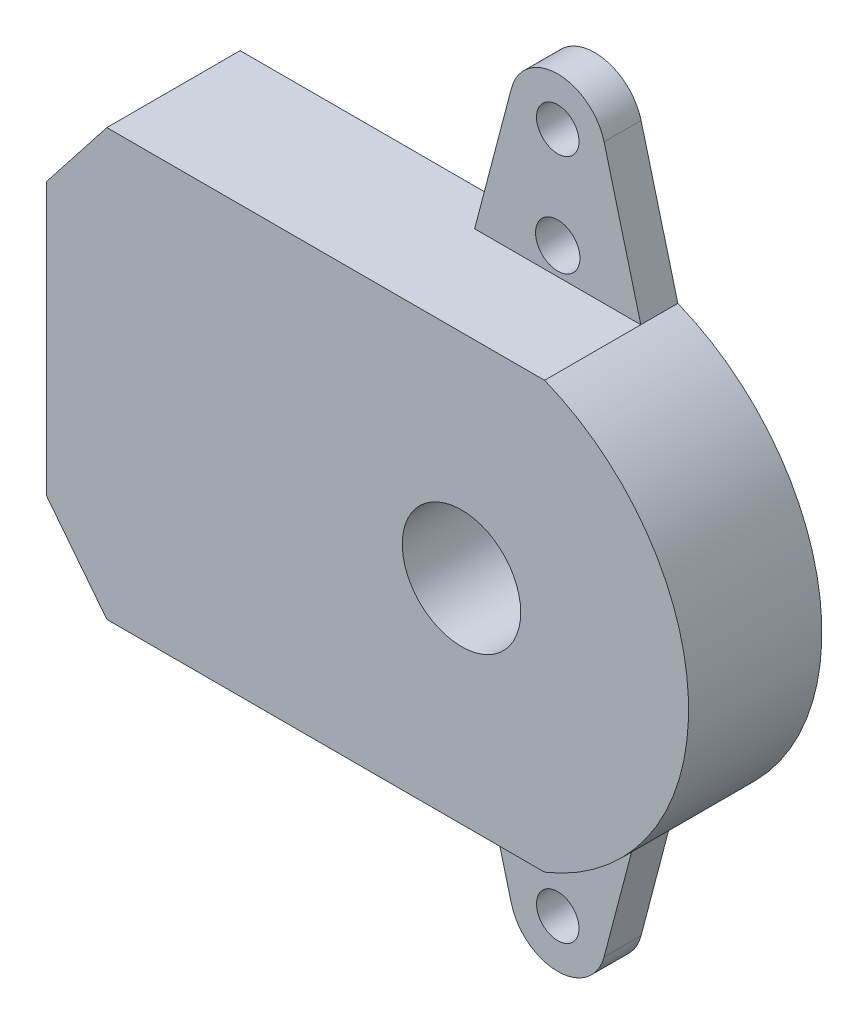
ISO-10303-21;
HEADER;
FILE_DESCRIPTION(('STEP AP214'),'2;1');
FILE_NAME('part.step','',(''),(''),'','','');
FILE_SCHEMA(('AUTOMOTIVE_DESIGN { 1 0 10303 214 1 1 1 1 }'));
ENDSEC;
DATA;
#1=APPLICATION_CONTEXT('core data for automotive mechanical design processes');
#2=APPLICATION_PROTOCOL_DEFINITION('international standard','automotive_design',2000,#1);
#3=PRODUCT_CONTEXT('',#1,'mechanical');
#4=PRODUCT('Part','Part','',(#3));
#5=PRODUCT_RELATED_PRODUCT_CATEGORY('part','',(#4));
#6=PRODUCT_DEFINITION_FORMATION('','',#4);
#7=PRODUCT_DEFINITION_CONTEXT('part definition',#1,'design');
#8=PRODUCT_DEFINITION('design','',#6,#7);
#9=PRODUCT_DEFINITION_SHAPE('','',#8);
#10=(LENGTH_UNIT() NAMED_UNIT(*) SI_UNIT(.MILLI.,.METRE.));
#11=(NAMED_UNIT(*) PLANE_ANGLE_UNIT() SI_UNIT($,.RADIAN.));
#12=(NAMED_UNIT(*) SI_UNIT($,.STERADIAN.) SOLID_ANGLE_UNIT());
#13=UNCERTAINTY_MEASURE_WITH_UNIT(LENGTH_MEASURE(1.E-05),#10,'distance_accuracy_value','');
#14=(GEOMETRIC_REPRESENTATION_CONTEXT(3) GLOBAL_UNCERTAINTY_ASSIGNED_CONTEXT((#13)) GLOBAL_UNIT_ASSIGNED_CONTEXT((#10,
#11,#12)) REPRESENTATION_CONTEXT('',''));
#15=CARTESIAN_POINT('',(0.,0.,0.));
#16=DIRECTION('',(0.,0.,1.));
#17=DIRECTION('',(1.,0.,0.));
#18=AXIS2_PLACEMENT_3D('',#15,#16,#17);
#19=CARTESIAN_POINT('',(28.04,-8.6275,2.5));
#20=DIRECTION('',(0.,0.,1.));
#21=DIRECTION('',(1.,0.,0.));
#22=AXIS2_PLACEMENT_3D('',#19,#20,#21);
#23=PLANE('',#22);
#24=DIRECTION('',(-1.,0.,0.));
#25=VECTOR('',#24,1.);
#26=CARTESIAN_POINT('',(4.08749837592054,28.77,2.5));
#27=LINE('',#26,#25);
#28=CARTESIAN_POINT('',(33.6525016240795,28.77,2.5));
#29=VERTEX_POINT('',#28);
#30=CARTESIAN_POINT('',(22.4274983759205,28.77,2.5));
#31=VERTEX_POINT('',#30);
#32=EDGE_CURVE('E129',#29,#31,#27,.T.);
#33=ORIENTED_EDGE('',*,*,#32,.F.);
#34=DIRECTION('',(-0.253955475555716,0.967215909937006,0.));
#35=VECTOR('',#34,1.);
#36=CARTESIAN_POINT('',(31.1713615084211,38.2196808521116,2.5));
#37=LINE('',#36,#35);
#38=CARTESIAN_POINT('',(31.1713615084211,38.2196808521116,2.5));
#39=VERTEX_POINT('',#38);
#40=EDGE_CURVE('E122',#29,#39,#37,.T.);
#41=ORIENTED_EDGE('',*,*,#40,.T.);
#42=CARTESIAN_POINT('',(28.04,37.3975,2.5));
#43=DIRECTION('',(0.,0.,1.));
#44=DIRECTION('',(-1.,0.,0.));
#45=AXIS2_PLACEMENT_3D('',#42,#43,#44);
#46=CIRCLE('',#45,3.2375);
#47=CARTESIAN_POINT('',(24.9086384915789,38.2196808521116,2.5));
#48=VERTEX_POINT('',#47);
#49=EDGE_CURVE('E126',#39,#48,#46,.T.);
#50=ORIENTED_EDGE('',*,*,#49,.T.);
#51=DIRECTION('',(-0.253955475555716,-0.967215909937006,0.));
#52=VECTOR('',#51,1.);
#53=CARTESIAN_POINT('',(22.4274983759205,28.77,2.5));
#54=LINE('',#53,#52);
#55=EDGE_CURVE('E54',#48,#31,#54,.T.);
#56=ORIENTED_EDGE('',*,*,#55,.T.);
#57=EDGE_LOOP('',(#33,#41,#50,#56));
#58=FACE_BOUND('',#57,.T.);
#59=CARTESIAN_POINT('',(28.04,37.3975,2.5));
#60=DIRECTION('',(0.,0.,1.));
#61=DIRECTION('',(1.,0.,0.));
#62=AXIS2_PLACEMENT_3D('',#59,#60,#61);
#63=CIRCLE('',#62,1.435);
#64=CARTESIAN_POINT('',(29.475,37.3975,2.5));
#65=VERTEX_POINT('',#64);
#66=EDGE_CURVE('E156',#65,#65,#63,.T.);
#67=ORIENTED_EDGE('',*,*,#66,.F.);
#68=EDGE_LOOP('',(#67));
#69=FACE_BOUND('',#68,.T.);
#70=CARTESIAN_POINT('',(28.04,30.6,2.5));
#71=DIRECTION('',(0.,0.,1.));
#72=DIRECTION('',(1.,0.,0.));
#73=AXIS2_PLACEMENT_3D('',#70,#71,#72);
#74=CIRCLE('',#73,1.5);
#75=CARTESIAN_POINT('',(29.54,30.6,2.5));
#76=VERTEX_POINT('',#75);
#77=EDGE_CURVE('E215',#76,#76,#74,.T.);
#78=ORIENTED_EDGE('',*,*,#77,.F.);
#79=EDGE_LOOP('',(#78));
#80=FACE_BOUND('',#79,.T.);
#81=ADVANCED_FACE('F35',(#58,#69,#80),#23,.T.);
#82=DIRECTION('',(1.,0.,0.));
#83=VECTOR('',#82,1.);
#84=CARTESIAN_POINT('',(33.6525016240795,0.,2.5));
#85=LINE('',#84,#83);
#86=CARTESIAN_POINT('',(22.4274983759205,0.,2.5));
#87=VERTEX_POINT('',#86);
#88=CARTESIAN_POINT('',(33.6525016240795,0.,2.5));
#89=VERTEX_POINT('',#88);
#90=EDGE_CURVE('E11',#87,#89,#85,.T.);
#91=ORIENTED_EDGE('',*,*,#90,.F.);
#92=DIRECTION('',(0.253955475555716,-0.967215909937006,0.));
#93=VECTOR('',#92,1.);
#94=CARTESIAN_POINT('',(22.4274983759205,0.,2.5));
#95=LINE('',#94,#93);
#96=CARTESIAN_POINT('',(24.9086384915789,-9.44968085211163,2.5));
#97=VERTEX_POINT('',#96);
#98=EDGE_CURVE('E175',#87,#97,#95,.T.);
#99=ORIENTED_EDGE('',*,*,#98,.T.);
#100=CARTESIAN_POINT('',(28.04,-8.6275,2.5));
#101=DIRECTION('',(0.,0.,1.));
#102=DIRECTION('',(1.,0.,0.));
#103=AXIS2_PLACEMENT_3D('',#100,#101,#102);
#104=CIRCLE('',#103,3.2375);
#105=CARTESIAN_POINT('',(31.1713615084211,-9.44968085211163,2.5));
#106=VERTEX_POINT('',#105);
#107=EDGE_CURVE('E231',#97,#106,#104,.T.);
#108=ORIENTED_EDGE('',*,*,#107,.T.);
#109=DIRECTION('',(0.253955475555716,0.967215909937006,0.));
#110=VECTOR('',#109,1.);
#111=CARTESIAN_POINT('',(31.1713615084211,-9.44968085211163,2.5));
#112=LINE('',#111,#110);
#113=EDGE_CURVE('E134',#106,#89,#112,.T.);
#114=ORIENTED_EDGE('',*,*,#113,.T.);
#115=EDGE_LOOP('',(#91,#99,#108,#114));
#116=FACE_BOUND('',#115,.T.);
#117=CARTESIAN_POINT('',(28.04,-8.6275,2.5));
#118=DIRECTION('',(0.,0.,1.));
#119=DIRECTION('',(1.,0.,0.));
#120=AXIS2_PLACEMENT_3D('',#117,#118,#119);
#121=CIRCLE('',#120,1.435);
#122=CARTESIAN_POINT('',(29.475,-8.6275,2.5));
#123=VERTEX_POINT('',#122);
#124=EDGE_CURVE('E221',#123,#123,#121,.T.);
#125=ORIENTED_EDGE('',*,*,#124,.F.);
#126=EDGE_LOOP('',(#125));
#127=FACE_BOUND('',#126,.T.);
#128=CARTESIAN_POINT('',(28.04,-1.83,2.5));
#129=DIRECTION('',(0.,0.,1.));
#130=DIRECTION('',(1.,0.,0.));
#131=AXIS2_PLACEMENT_3D('',#128,#129,#130);
#132=CIRCLE('',#131,1.5);
#133=CARTESIAN_POINT('',(29.54,-1.83,2.5));
#134=VERTEX_POINT('',#133);
#135=EDGE_CURVE('E208',#134,#134,#132,.T.);
#136=ORIENTED_EDGE('',*,*,#135,.F.);
#137=EDGE_LOOP('',(#136));
#138=FACE_BOUND('',#137,.T.);
#139=ADVANCED_FACE('F233',(#116,#127,#138),#23,.T.);
#140=CARTESIAN_POINT('',(28.04,-8.6275,0.));
#141=DIRECTION('',(0.,0.,1.));
#142=DIRECTION('',(1.,0.,0.));
#143=AXIS2_PLACEMENT_3D('',#140,#141,#142);
#144=PLANE('',#143);
#145=CARTESIAN_POINT('',(28.04,14.385,0.));
#146=DIRECTION('',(0.,0.,1.));
#147=DIRECTION('',(1.,0.,0.));
#148=AXIS2_PLACEMENT_3D('',#145,#146,#147);
#149=CIRCLE('',#148,4.);
#150=CARTESIAN_POINT('',(32.04,14.385,0.));
#151=VERTEX_POINT('',#150);
#152=EDGE_CURVE('E205',#151,#151,#149,.T.);
#153=ORIENTED_EDGE('',*,*,#152,.T.);
#154=EDGE_LOOP('',(#153));
#155=FACE_BOUND('',#154,.T.);
#156=DIRECTION('',(-0.616887828188147,-0.787051083115519,0.));
#157=VECTOR('',#156,1.);
#158=CARTESIAN_POINT('',(4.08749837592054,28.77,0.));
#159=LINE('',#158,#157);
#160=CARTESIAN_POINT('',(4.08749837592054,28.77,0.));
#161=VERTEX_POINT('',#160);
#162=CARTESIAN_POINT('',(0.,23.555,0.));
#163=VERTEX_POINT('',#162);
#164=EDGE_CURVE('E152',#161,#163,#159,.T.);
#165=ORIENTED_EDGE('',*,*,#164,.F.);
#166=DIRECTION('',(-1.,0.,0.));
#167=VECTOR('',#166,1.);
#168=CARTESIAN_POINT('',(22.4274983759205,28.77,0.));
#169=LINE('',#168,#167);
#170=CARTESIAN_POINT('',(22.4274983759205,28.77,0.));
#171=VERTEX_POINT('',#170);
#172=EDGE_CURVE('E102',#171,#161,#169,.T.);
#173=ORIENTED_EDGE('',*,*,#172,.F.);
#174=DIRECTION('',(-0.253955475555716,-0.967215909937006,0.));
#175=VECTOR('',#174,1.);
#176=CARTESIAN_POINT('',(22.4274983759205,28.77,0.));
#177=LINE('',#176,#175);
#178=CARTESIAN_POINT('',(24.9086384915789,38.2196808521116,0.));
#179=VERTEX_POINT('',#178);
#180=EDGE_CURVE('E95',#179,#171,#177,.T.);
#181=ORIENTED_EDGE('',*,*,#180,.F.);
#182=CARTESIAN_POINT('',(28.04,37.3975,0.));
#183=DIRECTION('',(0.,0.,1.));
#184=DIRECTION('',(-1.,0.,0.));
#185=AXIS2_PLACEMENT_3D('',#182,#183,#184);
#186=CIRCLE('',#185,3.2375);
#187=CARTESIAN_POINT('',(31.1713615084211,38.2196808521116,0.));
#188=VERTEX_POINT('',#187);
#189=EDGE_CURVE('E171',#188,#179,#186,.T.);
#190=ORIENTED_EDGE('',*,*,#189,.F.);
#191=DIRECTION('',(-0.253955475555716,0.967215909937006,0.));
#192=VECTOR('',#191,1.);
#193=CARTESIAN_POINT('',(31.1713615084211,38.2196808521116,0.));
#194=LINE('',#193,#192);
#195=CARTESIAN_POINT('',(33.6525016240795,28.77,0.));
#196=VERTEX_POINT('',#195);
#197=EDGE_CURVE('E140',#196,#188,#194,.T.);
#198=ORIENTED_EDGE('',*,*,#197,.F.);
#199=CARTESIAN_POINT('',(27.88,14.385,0.));
#200=DIRECTION('',(0.,0.,1.));
#201=DIRECTION('',(1.,0.,0.));
#202=AXIS2_PLACEMENT_3D('',#199,#200,#201);
#203=CIRCLE('',#202,15.5);
#204=CARTESIAN_POINT('',(33.6525016240795,0.,0.));
#205=VERTEX_POINT('',#204);
#206=EDGE_CURVE('E168',#205,#196,#203,.T.);
#207=ORIENTED_EDGE('',*,*,#206,.F.);
#208=DIRECTION('',(0.253955475555716,0.967215909937006,0.));
#209=VECTOR('',#208,1.);
#210=CARTESIAN_POINT('',(31.1713615084211,-9.44968085211163,0.));
#211=LINE('',#210,#209);
#212=CARTESIAN_POINT('',(31.1713615084211,-9.44968085211163,0.));
#213=VERTEX_POINT('',#212);
#214=EDGE_CURVE('E166',#213,#205,#211,.T.);
#215=ORIENTED_EDGE('',*,*,#214,.F.);
#216=CARTESIAN_POINT('',(28.04,-8.6275,0.));
#217=DIRECTION('',(0.,0.,1.));
#218=DIRECTION('',(1.,0.,0.));
#219=AXIS2_PLACEMENT_3D('',#216,#217,#218);
#220=CIRCLE('',#219,3.2375);
#221=CARTESIAN_POINT('',(24.9086384915789,-9.44968085211163,0.));
#222=VERTEX_POINT('',#221);
#223=EDGE_CURVE('E164',#222,#213,#220,.T.);
#224=ORIENTED_EDGE('',*,*,#223,.F.);
#225=DIRECTION('',(0.253955475555716,-0.967215909937006,0.));
#226=VECTOR('',#225,1.);
#227=CARTESIAN_POINT('',(22.4274983759205,0.,0.));
#228=LINE('',#227,#226);
#229=CARTESIAN_POINT('',(22.4274983759205,0.,0.));
#230=VERTEX_POINT('',#229);
#231=EDGE_CURVE('E162',#230,#222,#228,.T.);
#232=ORIENTED_EDGE('',*,*,#231,.F.);
#233=DIRECTION('',(1.,0.,0.));
#234=VECTOR('',#233,1.);
#235=CARTESIAN_POINT('',(4.08749837592054,0.,0.));
#236=LINE('',#235,#234);
#237=CARTESIAN_POINT('',(4.08749837592054,0.,0.));
#238=VERTEX_POINT('',#237);
#239=EDGE_CURVE('E160',#238,#230,#236,.T.);
#240=ORIENTED_EDGE('',*,*,#239,.F.);
#241=DIRECTION('',(0.616887828188146,-0.787051083115519,0.));
#242=VECTOR('',#241,1.);
#243=CARTESIAN_POINT('',(0.,5.215,0.));
#244=LINE('',#243,#242);
#245=CARTESIAN_POINT('',(0.,5.215,0.));
#246=VERTEX_POINT('',#245);
#247=EDGE_CURVE('E158',#246,#238,#244,.T.);
#248=ORIENTED_EDGE('',*,*,#247,.F.);
#249=DIRECTION('',(0.,-1.,0.));
#250=VECTOR('',#249,1.);
#251=CARTESIAN_POINT('',(0.,23.555,0.));
#252=LINE('',#251,#250);
#253=EDGE_CURVE('E155',#163,#246,#252,.T.);
#254=ORIENTED_EDGE('',*,*,#253,.F.);
#255=EDGE_LOOP('',(#165,#173,#181,#190,#198,#207,#215,#224,#232,#240,#248,#254));
#256=FACE_BOUND('',#255,.T.);
#257=CARTESIAN_POINT('',(28.04,37.3975,0.));
#258=DIRECTION('',(0.,0.,1.));
#259=DIRECTION('',(1.,0.,0.));
#260=AXIS2_PLACEMENT_3D('',#257,#258,#259);
#261=CIRCLE('',#260,1.435);
#262=CARTESIAN_POINT('',(29.475,37.3975,0.));
#263=VERTEX_POINT('',#262);
#264=EDGE_CURVE('E224',#263,#263,#261,.T.);
#265=ORIENTED_EDGE('',*,*,#264,.T.);
#266=EDGE_LOOP('',(#265));
#267=FACE_BOUND('',#266,.T.);
#268=CARTESIAN_POINT('',(28.04,-8.6275,0.));
#269=DIRECTION('',(0.,0.,1.));
#270=DIRECTION('',(1.,0.,0.));
#271=AXIS2_PLACEMENT_3D('',#268,#269,#270);
#272=CIRCLE('',#271,1.435);
#273=CARTESIAN_POINT('',(29.475,-8.6275,0.));
#274=VERTEX_POINT('',#273);
#275=EDGE_CURVE('E218',#274,#274,#272,.T.);
#276=ORIENTED_EDGE('',*,*,#275,.T.);
#277=EDGE_LOOP('',(#276));
#278=FACE_BOUND('',#277,.T.);
#279=CARTESIAN_POINT('',(28.04,30.6,0.));
#280=DIRECTION('',(0.,0.,1.));
#281=DIRECTION('',(1.,0.,0.));
#282=AXIS2_PLACEMENT_3D('',#279,#280,#281);
#283=CIRCLE('',#282,1.5);
#284=CARTESIAN_POINT('',(29.54,30.6,0.));
#285=VERTEX_POINT('',#284);
#286=EDGE_CURVE('E211',#285,#285,#283,.T.);
#287=ORIENTED_EDGE('',*,*,#286,.T.);
#288=EDGE_LOOP('',(#287));
#289=FACE_BOUND('',#288,.T.);
#290=CARTESIAN_POINT('',(28.04,-1.83,0.));
#291=DIRECTION('',(0.,0.,1.));
#292=DIRECTION('',(1.,0.,0.));
#293=AXIS2_PLACEMENT_3D('',#290,#291,#292);
#294=CIRCLE('',#293,1.5);
#295=CARTESIAN_POINT('',(29.54,-1.83,0.));
#296=VERTEX_POINT('',#295);
#297=EDGE_CURVE('E212',#296,#296,#294,.T.);
#298=ORIENTED_EDGE('',*,*,#297,.T.);
#299=EDGE_LOOP('',(#298));
#300=FACE_BOUND('',#299,.T.);
#301=ADVANCED_FACE('F310',(#155,#256,#267,#278,#289,#300),#144,.F.);
#302=CARTESIAN_POINT('',(4.08749837592054,28.77,2.5));
#303=DIRECTION('',(0.787051083115519,-0.616887828188147,0.));
#304=DIRECTION('',(0.616887828188147,0.787051083115519,0.));
#305=AXIS2_PLACEMENT_3D('',#302,#303,#304);
#306=PLANE('',#305);
#307=ORIENTED_EDGE('',*,*,#164,.T.);
#308=DIRECTION('',(0.,0.,-1.));
#309=VECTOR('',#308,1.);
#310=CARTESIAN_POINT('',(0.,23.555,2.5));
#311=LINE('',#310,#309);
#312=CARTESIAN_POINT('',(0.,23.555,9.));
#313=VERTEX_POINT('',#312);
#314=EDGE_CURVE('E45',#313,#163,#311,.T.);
#315=ORIENTED_EDGE('',*,*,#314,.F.);
#316=DIRECTION('',(-0.616887828188147,-0.787051083115519,0.));
#317=VECTOR('',#316,1.);
#318=CARTESIAN_POINT('',(4.08749837592054,28.77,9.));
#319=LINE('',#318,#317);
#320=CARTESIAN_POINT('',(4.08749837592054,28.77,9.));
#321=VERTEX_POINT('',#320);
#322=EDGE_CURVE('E204',#321,#313,#319,.T.);
#323=ORIENTED_EDGE('',*,*,#322,.F.);
#324=DIRECTION('',(0.,0.,-1.));
#325=VECTOR('',#324,1.);
#326=CARTESIAN_POINT('',(4.08749837592054,28.77,2.5));
#327=LINE('',#326,#325);
#328=EDGE_CURVE('E148',#321,#161,#327,.T.);
#329=ORIENTED_EDGE('',*,*,#328,.T.);
#330=EDGE_LOOP('',(#307,#315,#323,#329));
#331=FACE_BOUND('',#330,.T.);
#332=ADVANCED_FACE('F37',(#331),#306,.F.);
#333=CARTESIAN_POINT('',(0.,23.555,2.5));
#334=DIRECTION('',(1.,0.,0.));
#335=DIRECTION('',(0.,0.,-1.));
#336=AXIS2_PLACEMENT_3D('',#333,#334,#335);
#337=PLANE('',#336);
#338=ORIENTED_EDGE('',*,*,#253,.T.);
#339=DIRECTION('',(0.,0.,-1.));
#340=VECTOR('',#339,1.);
#341=CARTESIAN_POINT('',(0.,5.215,2.5));
#342=LINE('',#341,#340);
#343=CARTESIAN_POINT('',(0.,5.215,9.));
#344=VERTEX_POINT('',#343);
#345=EDGE_CURVE('E193',#344,#246,#342,.T.);
#346=ORIENTED_EDGE('',*,*,#345,.F.);
#347=DIRECTION('',(0.,-1.,0.));
#348=VECTOR('',#347,1.);
#349=CARTESIAN_POINT('',(0.,5.215,9.));
#350=LINE('',#349,#348);
#351=EDGE_CURVE('E268',#313,#344,#350,.T.);
#352=ORIENTED_EDGE('',*,*,#351,.F.);
#353=ORIENTED_EDGE('',*,*,#314,.T.);
#354=EDGE_LOOP('',(#338,#346,#352,#353));
#355=FACE_BOUND('',#354,.T.);
#356=ADVANCED_FACE('F304',(#355),#337,.F.);
#357=CARTESIAN_POINT('',(0.,5.215,2.5));
#358=DIRECTION('',(0.787051083115519,0.616887828188146,0.));
#359=DIRECTION('',(-0.616887828188146,0.787051083115519,0.));
#360=AXIS2_PLACEMENT_3D('',#357,#358,#359);
#361=PLANE('',#360);
#362=ORIENTED_EDGE('',*,*,#247,.T.);
#363=DIRECTION('',(0.,0.,-1.));
#364=VECTOR('',#363,1.);
#365=CARTESIAN_POINT('',(4.08749837592054,0.,2.5));
#366=LINE('',#365,#364);
#367=CARTESIAN_POINT('',(4.08749837592054,0.,9.));
#368=VERTEX_POINT('',#367);
#369=EDGE_CURVE('E190',#368,#238,#366,.T.);
#370=ORIENTED_EDGE('',*,*,#369,.F.);
#371=DIRECTION('',(0.616887828188146,-0.787051083115519,0.));
#372=VECTOR('',#371,1.);
#373=CARTESIAN_POINT('',(4.08749837592054,0.,9.));
#374=LINE('',#373,#372);
#375=EDGE_CURVE('E265',#344,#368,#374,.T.);
#376=ORIENTED_EDGE('',*,*,#375,.F.);
#377=ORIENTED_EDGE('',*,*,#345,.T.);
#378=EDGE_LOOP('',(#362,#370,#376,#377));
#379=FACE_BOUND('',#378,.T.);
#380=ADVANCED_FACE('F307',(#379),#361,.F.);
#381=CARTESIAN_POINT('',(4.08749837592054,0.,2.5));
#382=DIRECTION('',(0.,1.,0.));
#383=DIRECTION('',(-1.,0.,0.));
#384=AXIS2_PLACEMENT_3D('',#381,#382,#383);
#385=PLANE('',#384);
#386=ORIENTED_EDGE('',*,*,#239,.T.);
#387=DIRECTION('',(0.,0.,-1.));
#388=VECTOR('',#387,1.);
#389=CARTESIAN_POINT('',(22.4274983759205,0.,2.5));
#390=LINE('',#389,#388);
#391=EDGE_CURVE('E189',#87,#230,#390,.T.);
#392=ORIENTED_EDGE('',*,*,#391,.F.);
#393=ORIENTED_EDGE('',*,*,#90,.T.);
#394=DIRECTION('',(0.,0.,-1.));
#395=VECTOR('',#394,1.);
#396=CARTESIAN_POINT('',(33.6525016240795,0.,9.));
#397=LINE('',#396,#395);
#398=CARTESIAN_POINT('',(33.6525016240795,0.,9.));
#399=VERTEX_POINT('',#398);
#400=EDGE_CURVE('E206',#399,#89,#397,.T.);
#401=ORIENTED_EDGE('',*,*,#400,.F.);
#402=DIRECTION('',(1.,0.,0.));
#403=VECTOR('',#402,1.);
#404=CARTESIAN_POINT('',(33.6525016240795,0.,9.));
#405=LINE('',#404,#403);
#406=EDGE_CURVE('E262',#368,#399,#405,.T.);
#407=ORIENTED_EDGE('',*,*,#406,.F.);
#408=ORIENTED_EDGE('',*,*,#369,.T.);
#409=EDGE_LOOP('',(#386,#392,#393,#401,#407,#408));
#410=FACE_BOUND('',#409,.T.);
#411=ADVANCED_FACE('F243',(#410),#385,.F.);
#412=CARTESIAN_POINT('',(22.4274983759205,0.,2.5));
#413=DIRECTION('',(0.967215909937006,0.253955475555716,0.));
#414=DIRECTION('',(-0.253955475555716,0.967215909937006,0.));
#415=AXIS2_PLACEMENT_3D('',#412,#413,#414);
#416=PLANE('',#415);
#417=ORIENTED_EDGE('',*,*,#231,.T.);
#418=DIRECTION('',(0.,0.,-1.));
#419=VECTOR('',#418,1.);
#420=CARTESIAN_POINT('',(24.9086384915789,-9.44968085211163,2.5));
#421=LINE('',#420,#419);
#422=EDGE_CURVE('E186',#97,#222,#421,.T.);
#423=ORIENTED_EDGE('',*,*,#422,.F.);
#424=ORIENTED_EDGE('',*,*,#98,.F.);
#425=ORIENTED_EDGE('',*,*,#391,.T.);
#426=EDGE_LOOP('',(#417,#423,#424,#425));
#427=FACE_BOUND('',#426,.T.);
#428=ADVANCED_FACE('F315',(#427),#416,.F.);
#429=CARTESIAN_POINT('',(28.04,-8.6275,2.5));
#430=DIRECTION('',(0.,0.,-1.));
#431=DIRECTION('',(-1.,0.,0.));
#432=AXIS2_PLACEMENT_3D('',#429,#430,#431);
#433=CYLINDRICAL_SURFACE('',#432,3.2375);
#434=ORIENTED_EDGE('',*,*,#223,.T.);
#435=DIRECTION('',(0.,0.,-1.));
#436=VECTOR('',#435,1.);
#437=CARTESIAN_POINT('',(31.1713615084211,-9.44968085211163,2.5));
#438=LINE('',#437,#436);
#439=EDGE_CURVE('E183',#106,#213,#438,.T.);
#440=ORIENTED_EDGE('',*,*,#439,.F.);
#441=ORIENTED_EDGE('',*,*,#107,.F.);
#442=ORIENTED_EDGE('',*,*,#422,.T.);
#443=EDGE_LOOP('',(#434,#440,#441,#442));
#444=FACE_BOUND('',#443,.T.);
#445=ADVANCED_FACE('F463',(#444),#433,.T.);
#446=CARTESIAN_POINT('',(31.1713615084211,-9.44968085211163,2.5));
#447=DIRECTION('',(-0.967215909937006,0.253955475555716,0.));
#448=DIRECTION('',(-0.253955475555716,-0.967215909937006,0.));
#449=AXIS2_PLACEMENT_3D('',#446,#447,#448);
#450=PLANE('',#449);
#451=ORIENTED_EDGE('',*,*,#214,.T.);
#452=DIRECTION('',(0.,0.,-1.));
#453=VECTOR('',#452,1.);
#454=CARTESIAN_POINT('',(33.6525016240795,0.,2.5));
#455=LINE('',#454,#453);
#456=EDGE_CURVE('E180',#89,#205,#455,.T.);
#457=ORIENTED_EDGE('',*,*,#456,.F.);
#458=ORIENTED_EDGE('',*,*,#113,.F.);
#459=ORIENTED_EDGE('',*,*,#439,.T.);
#460=EDGE_LOOP('',(#451,#457,#458,#459));
#461=FACE_BOUND('',#460,.T.);
#462=ADVANCED_FACE('F454',(#461),#450,.F.);
#463=CARTESIAN_POINT('',(27.88,14.385,2.5));
#464=DIRECTION('',(0.,0.,-1.));
#465=DIRECTION('',(-1.,0.,0.));
#466=AXIS2_PLACEMENT_3D('',#463,#464,#465);
#467=CYLINDRICAL_SURFACE('',#466,15.5);
#468=ORIENTED_EDGE('',*,*,#206,.T.);
#469=DIRECTION('',(0.,0.,-1.));
#470=VECTOR('',#469,1.);
#471=CARTESIAN_POINT('',(33.6525016240795,28.77,2.5));
#472=LINE('',#471,#470);
#473=EDGE_CURVE('E143',#29,#196,#472,.T.);
#474=ORIENTED_EDGE('',*,*,#473,.F.);
#475=DIRECTION('',(0.,0.,-1.));
#476=VECTOR('',#475,1.);
#477=CARTESIAN_POINT('',(33.6525016240795,28.77,9.));
#478=LINE('',#477,#476);
#479=CARTESIAN_POINT('',(33.6525016240795,28.77,9.));
#480=VERTEX_POINT('',#479);
#481=EDGE_CURVE('E255',#480,#29,#478,.T.);
#482=ORIENTED_EDGE('',*,*,#481,.F.);
#483=CARTESIAN_POINT('',(27.88,14.385,9.));
#484=DIRECTION('',(0.,0.,1.));
#485=DIRECTION('',(-1.,0.,0.));
#486=AXIS2_PLACEMENT_3D('',#483,#484,#485);
#487=CIRCLE('',#486,15.5);
#488=EDGE_CURVE('E254',#399,#480,#487,.T.);
#489=ORIENTED_EDGE('',*,*,#488,.F.);
#490=ORIENTED_EDGE('',*,*,#400,.T.);
#491=ORIENTED_EDGE('',*,*,#456,.T.);
#492=EDGE_LOOP('',(#468,#474,#482,#489,#490,#491));
#493=FACE_BOUND('',#492,.T.);
#494=ADVANCED_FACE('F250',(#493),#467,.T.);
#495=CARTESIAN_POINT('',(31.1713615084211,38.2196808521116,2.5));
#496=DIRECTION('',(-0.967215909937006,-0.253955475555716,0.));
#497=DIRECTION('',(0.253955475555716,-0.967215909937006,0.));
#498=AXIS2_PLACEMENT_3D('',#495,#496,#497);
#499=PLANE('',#498);
#500=ORIENTED_EDGE('',*,*,#197,.T.);
#501=DIRECTION('',(0.,0.,-1.));
#502=VECTOR('',#501,1.);
#503=CARTESIAN_POINT('',(31.1713615084211,38.2196808521116,2.5));
#504=LINE('',#503,#502);
#505=EDGE_CURVE('E137',#39,#188,#504,.T.);
#506=ORIENTED_EDGE('',*,*,#505,.F.);
#507=ORIENTED_EDGE('',*,*,#40,.F.);
#508=ORIENTED_EDGE('',*,*,#473,.T.);
#509=EDGE_LOOP('',(#500,#506,#507,#508));
#510=FACE_BOUND('',#509,.T.);
#511=ADVANCED_FACE('F138',(#510),#499,.F.);
#512=CARTESIAN_POINT('',(28.04,37.3975,2.5));
#513=DIRECTION('',(0.,0.,-1.));
#514=DIRECTION('',(-1.,0.,0.));
#515=AXIS2_PLACEMENT_3D('',#512,#513,#514);
#516=CYLINDRICAL_SURFACE('',#515,3.2375);
#517=ORIENTED_EDGE('',*,*,#189,.T.);
#518=DIRECTION('',(0.,0.,-1.));
#519=VECTOR('',#518,1.);
#520=CARTESIAN_POINT('',(24.9086384915789,38.2196808521116,2.5));
#521=LINE('',#520,#519);
#522=EDGE_CURVE('E144',#48,#179,#521,.T.);
#523=ORIENTED_EDGE('',*,*,#522,.F.);
#524=ORIENTED_EDGE('',*,*,#49,.F.);
#525=ORIENTED_EDGE('',*,*,#505,.T.);
#526=EDGE_LOOP('',(#517,#523,#524,#525));
#527=FACE_BOUND('',#526,.T.);
#528=ADVANCED_FACE('F146',(#527),#516,.T.);
#529=CARTESIAN_POINT('',(22.4274983759205,28.77,2.5));
#530=DIRECTION('',(0.967215909937006,-0.253955475555716,0.));
#531=DIRECTION('',(0.253955475555716,0.967215909937006,0.));
#532=AXIS2_PLACEMENT_3D('',#529,#530,#531);
#533=PLANE('',#532);
#534=ORIENTED_EDGE('',*,*,#180,.T.);
#535=DIRECTION('',(0.,0.,-1.));
#536=VECTOR('',#535,1.);
#537=CARTESIAN_POINT('',(22.4274983759205,28.77,2.5));
#538=LINE('',#537,#536);
#539=EDGE_CURVE('E177',#31,#171,#538,.T.);
#540=ORIENTED_EDGE('',*,*,#539,.F.);
#541=ORIENTED_EDGE('',*,*,#55,.F.);
#542=ORIENTED_EDGE('',*,*,#522,.T.);
#543=EDGE_LOOP('',(#534,#540,#541,#542));
#544=FACE_BOUND('',#543,.T.);
#545=ADVANCED_FACE('F326',(#544),#533,.F.);
#546=CARTESIAN_POINT('',(22.4274983759205,28.77,2.5));
#547=DIRECTION('',(0.,-1.,0.));
#548=DIRECTION('',(0.,0.,-1.));
#549=AXIS2_PLACEMENT_3D('',#546,#547,#548);
#550=PLANE('',#549);
#551=ORIENTED_EDGE('',*,*,#172,.T.);
#552=ORIENTED_EDGE('',*,*,#328,.F.);
#553=DIRECTION('',(-1.,0.,0.));
#554=VECTOR('',#553,1.);
#555=CARTESIAN_POINT('',(4.08749837592054,28.77,9.));
#556=LINE('',#555,#554);
#557=EDGE_CURVE('E256',#480,#321,#556,.T.);
#558=ORIENTED_EDGE('',*,*,#557,.F.);
#559=ORIENTED_EDGE('',*,*,#481,.T.);
#560=ORIENTED_EDGE('',*,*,#32,.T.);
#561=ORIENTED_EDGE('',*,*,#539,.T.);
#562=EDGE_LOOP('',(#551,#552,#558,#559,#560,#561));
#563=FACE_BOUND('',#562,.T.);
#564=ADVANCED_FACE('F325',(#563),#550,.F.);
#565=CARTESIAN_POINT('',(28.04,37.3975,2.5));
#566=DIRECTION('',(0.,0.,-1.));
#567=DIRECTION('',(-1.,0.,0.));
#568=AXIS2_PLACEMENT_3D('',#565,#566,#567);
#569=CYLINDRICAL_SURFACE('',#568,1.435);
#570=ORIENTED_EDGE('',*,*,#66,.T.);
#571=EDGE_LOOP('',(#570));
#572=FACE_BOUND('',#571,.T.);
#573=ORIENTED_EDGE('',*,*,#264,.F.);
#574=EDGE_LOOP('',(#573));
#575=FACE_BOUND('',#574,.T.);
#576=ADVANCED_FACE('F333',(#572,#575),#569,.F.);
#577=CARTESIAN_POINT('',(28.04,-8.6275,2.5));
#578=DIRECTION('',(0.,0.,-1.));
#579=DIRECTION('',(-1.,0.,0.));
#580=AXIS2_PLACEMENT_3D('',#577,#578,#579);
#581=CYLINDRICAL_SURFACE('',#580,1.435);
#582=ORIENTED_EDGE('',*,*,#124,.T.);
#583=EDGE_LOOP('',(#582));
#584=FACE_BOUND('',#583,.T.);
#585=ORIENTED_EDGE('',*,*,#275,.F.);
#586=EDGE_LOOP('',(#585));
#587=FACE_BOUND('',#586,.T.);
#588=ADVANCED_FACE('F360',(#584,#587),#581,.F.);
#589=CARTESIAN_POINT('',(28.04,30.6,2.5));
#590=DIRECTION('',(0.,0.,-1.));
#591=DIRECTION('',(-1.,0.,0.));
#592=AXIS2_PLACEMENT_3D('',#589,#590,#591);
#593=CYLINDRICAL_SURFACE('',#592,1.5);
#594=ORIENTED_EDGE('',*,*,#77,.T.);
#595=EDGE_LOOP('',(#594));
#596=FACE_BOUND('',#595,.T.);
#597=ORIENTED_EDGE('',*,*,#286,.F.);
#598=EDGE_LOOP('',(#597));
#599=FACE_BOUND('',#598,.T.);
#600=ADVANCED_FACE('F357',(#596,#599),#593,.F.);
#601=CARTESIAN_POINT('',(28.04,-1.83,2.5));
#602=DIRECTION('',(0.,0.,-1.));
#603=DIRECTION('',(-1.,0.,0.));
#604=AXIS2_PLACEMENT_3D('',#601,#602,#603);
#605=CYLINDRICAL_SURFACE('',#604,1.5);
#606=ORIENTED_EDGE('',*,*,#135,.T.);
#607=EDGE_LOOP('',(#606));
#608=FACE_BOUND('',#607,.T.);
#609=ORIENTED_EDGE('',*,*,#297,.F.);
#610=EDGE_LOOP('',(#609));
#611=FACE_BOUND('',#610,.T.);
#612=ADVANCED_FACE('F285',(#608,#611),#605,.F.);
#613=CARTESIAN_POINT('',(27.88,14.385,9.));
#614=DIRECTION('',(0.,0.,-1.));
#615=DIRECTION('',(-1.,0.,0.));
#616=AXIS2_PLACEMENT_3D('',#613,#614,#615);
#617=PLANE('',#616);
#618=CARTESIAN_POINT('',(28.04,14.385,9.));
#619=DIRECTION('',(0.,0.,1.));
#620=DIRECTION('',(1.,0.,0.));
#621=AXIS2_PLACEMENT_3D('',#618,#619,#620);
#622=CIRCLE('',#621,4.);
#623=CARTESIAN_POINT('',(32.04,14.385,9.));
#624=VERTEX_POINT('',#623);
#625=EDGE_CURVE('E275',#624,#624,#622,.T.);
#626=ORIENTED_EDGE('',*,*,#625,.F.);
#627=EDGE_LOOP('',(#626));
#628=FACE_BOUND('',#627,.T.);
#629=ORIENTED_EDGE('',*,*,#322,.T.);
#630=ORIENTED_EDGE('',*,*,#351,.T.);
#631=ORIENTED_EDGE('',*,*,#375,.T.);
#632=ORIENTED_EDGE('',*,*,#406,.T.);
#633=ORIENTED_EDGE('',*,*,#488,.T.);
#634=ORIENTED_EDGE('',*,*,#557,.T.);
#635=EDGE_LOOP('',(#629,#630,#631,#632,#633,#634));
#636=FACE_BOUND('',#635,.T.);
#637=ADVANCED_FACE('F282',(#628,#636),#617,.F.);
#638=CARTESIAN_POINT('',(28.04,14.385,-1.));
#639=DIRECTION('',(0.,0.,1.));
#640=DIRECTION('',(1.,0.,0.));
#641=AXIS2_PLACEMENT_3D('',#638,#639,#640);
#642=CYLINDRICAL_SURFACE('',#641,4.);
#643=ORIENTED_EDGE('',*,*,#625,.T.);
#644=EDGE_LOOP('',(#643));
#645=FACE_BOUND('',#644,.T.);
#646=ORIENTED_EDGE('',*,*,#152,.F.);
#647=EDGE_LOOP('',(#646));
#648=FACE_BOUND('',#647,.T.);
#649=ADVANCED_FACE('F279',(#645,#648),#642,.F.);
#650=CLOSED_SHELL('',(#81,#139,#301,#332,#356,#380,#411,#428,#445,#462,#494,#511,#528,#545,#564,
#576,#588,#600,#612,#637,#649));
#651=MANIFOLD_SOLID_BREP('B2',#650);
#652=ADVANCED_BREP_SHAPE_REPRESENTATION('',(#18,#651),#14);
#653=SHAPE_DEFINITION_REPRESENTATION(#9,#652);
ENDSEC;
END-ISO-10303-21;
